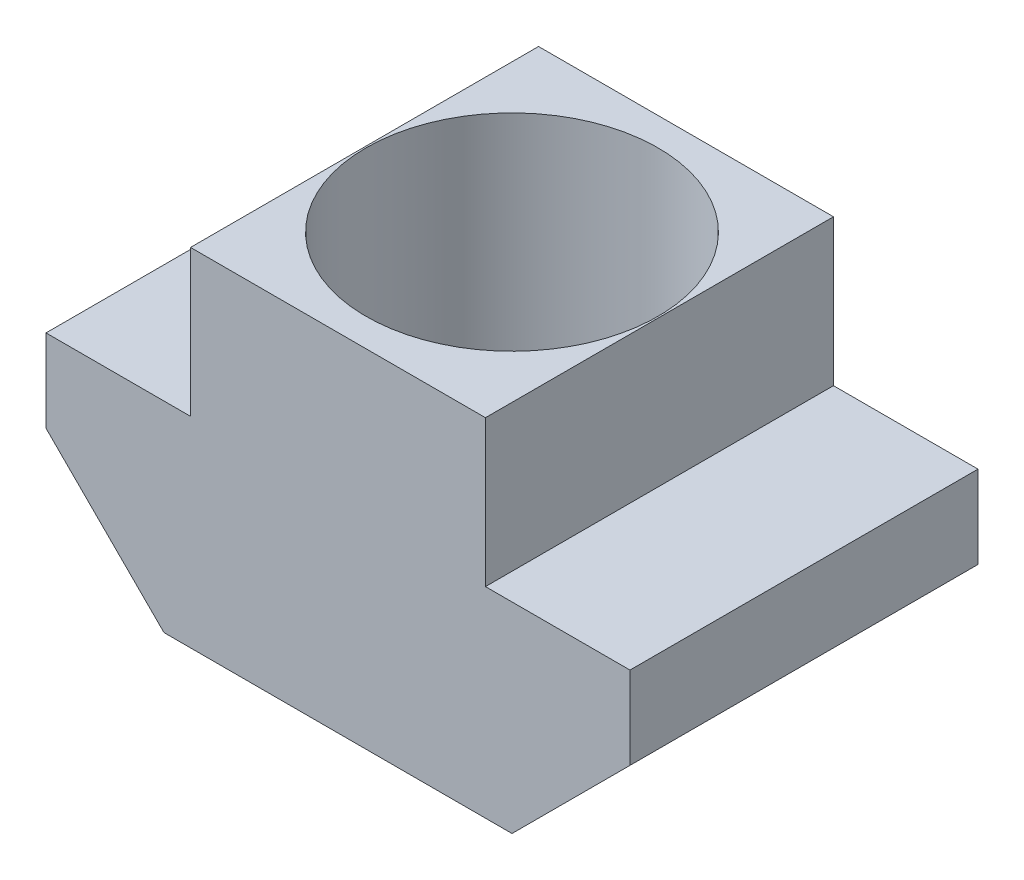
ISO-10303-21;
HEADER;
FILE_DESCRIPTION(('STEP AP214'),'2;1');
FILE_NAME('part.step','',(''),(''),'','','');
FILE_SCHEMA(('AUTOMOTIVE_DESIGN { 1 0 10303 214 1 1 1 1 }'));
ENDSEC;
DATA;
#1=APPLICATION_CONTEXT('core data for automotive mechanical design processes');
#2=APPLICATION_PROTOCOL_DEFINITION('international standard','automotive_design',2000,#1);
#3=PRODUCT_CONTEXT('',#1,'mechanical');
#4=PRODUCT('Part','Part','',(#3));
#5=PRODUCT_RELATED_PRODUCT_CATEGORY('part','',(#4));
#6=PRODUCT_DEFINITION_FORMATION('','',#4);
#7=PRODUCT_DEFINITION_CONTEXT('part definition',#1,'design');
#8=PRODUCT_DEFINITION('design','',#6,#7);
#9=PRODUCT_DEFINITION_SHAPE('','',#8);
#10=(LENGTH_UNIT() NAMED_UNIT(*) SI_UNIT(.MILLI.,.METRE.));
#11=(NAMED_UNIT(*) PLANE_ANGLE_UNIT() SI_UNIT($,.RADIAN.));
#12=(NAMED_UNIT(*) SI_UNIT($,.STERADIAN.) SOLID_ANGLE_UNIT());
#13=UNCERTAINTY_MEASURE_WITH_UNIT(LENGTH_MEASURE(1.E-05),#10,'distance_accuracy_value','');
#14=(GEOMETRIC_REPRESENTATION_CONTEXT(3) GLOBAL_UNCERTAINTY_ASSIGNED_CONTEXT((#13)) GLOBAL_UNIT_ASSIGNED_CONTEXT((#10,
#11,#12)) REPRESENTATION_CONTEXT('',''));
#15=CARTESIAN_POINT('',(0.,0.,0.));
#16=DIRECTION('',(0.,0.,1.));
#17=DIRECTION('',(1.,0.,0.));
#18=AXIS2_PLACEMENT_3D('',#15,#16,#17);
#19=CARTESIAN_POINT('',(-2.5,1.7,5.9));
#20=DIRECTION('',(0.,-1.,0.));
#21=DIRECTION('',(1.,0.,0.));
#22=AXIS2_PLACEMENT_3D('',#19,#20,#21);
#23=PLANE('',#22);
#24=DIRECTION('',(-1.,0.,0.));
#25=VECTOR('',#24,1.);
#26=CARTESIAN_POINT('',(-2.5,1.7,0.));
#27=LINE('',#26,#25);
#28=CARTESIAN_POINT('',(-2.5,1.7,0.));
#29=VERTEX_POINT('',#28);
#30=CARTESIAN_POINT('',(-4.95,1.7,0.));
#31=VERTEX_POINT('',#30);
#32=EDGE_CURVE('E146',#29,#31,#27,.T.);
#33=ORIENTED_EDGE('',*,*,#32,.T.);
#34=DIRECTION('',(0.,0.,-1.));
#35=VECTOR('',#34,1.);
#36=CARTESIAN_POINT('',(-4.95,1.7,5.9));
#37=LINE('',#36,#35);
#38=CARTESIAN_POINT('',(-4.95,1.7,5.9));
#39=VERTEX_POINT('',#38);
#40=EDGE_CURVE('E11',#39,#31,#37,.T.);
#41=ORIENTED_EDGE('',*,*,#40,.F.);
#42=DIRECTION('',(-1.,0.,0.));
#43=VECTOR('',#42,1.);
#44=CARTESIAN_POINT('',(-2.5,1.7,5.9));
#45=LINE('',#44,#43);
#46=CARTESIAN_POINT('',(-2.5,1.7,5.9));
#47=VERTEX_POINT('',#46);
#48=EDGE_CURVE('E165',#47,#39,#45,.T.);
#49=ORIENTED_EDGE('',*,*,#48,.F.);
#50=DIRECTION('',(0.,0.,-1.));
#51=VECTOR('',#50,1.);
#52=CARTESIAN_POINT('',(-2.5,1.7,5.9));
#53=LINE('',#52,#51);
#54=EDGE_CURVE('E142',#47,#29,#53,.T.);
#55=ORIENTED_EDGE('',*,*,#54,.T.);
#56=EDGE_LOOP('',(#33,#41,#49,#55));
#57=FACE_BOUND('',#56,.T.);
#58=ADVANCED_FACE('F38',(#57),#23,.F.);
#59=CARTESIAN_POINT('',(-4.95,0.299999999999998,5.9));
#60=DIRECTION('',(1.,0.,0.));
#61=DIRECTION('',(0.,0.,-1.));
#62=AXIS2_PLACEMENT_3D('',#59,#60,#61);
#63=PLANE('',#62);
#64=DIRECTION('',(0.,-1.,0.));
#65=VECTOR('',#64,1.);
#66=CARTESIAN_POINT('',(-4.95,0.299999999999998,0.));
#67=LINE('',#66,#65);
#68=CARTESIAN_POINT('',(-4.95,0.299999999999998,0.));
#69=VERTEX_POINT('',#68);
#70=EDGE_CURVE('E149',#31,#69,#67,.T.);
#71=ORIENTED_EDGE('',*,*,#70,.T.);
#72=DIRECTION('',(0.,0.,-1.));
#73=VECTOR('',#72,1.);
#74=CARTESIAN_POINT('',(-4.95,0.299999999999998,5.9));
#75=LINE('',#74,#73);
#76=CARTESIAN_POINT('',(-4.95,0.299999999999998,5.9));
#77=VERTEX_POINT('',#76);
#78=EDGE_CURVE('E46',#77,#69,#75,.T.);
#79=ORIENTED_EDGE('',*,*,#78,.F.);
#80=DIRECTION('',(0.,-1.,0.));
#81=VECTOR('',#80,1.);
#82=CARTESIAN_POINT('',(-4.95,0.299999999999998,5.9));
#83=LINE('',#82,#81);
#84=EDGE_CURVE('E103',#39,#77,#83,.T.);
#85=ORIENTED_EDGE('',*,*,#84,.F.);
#86=ORIENTED_EDGE('',*,*,#40,.T.);
#87=EDGE_LOOP('',(#71,#79,#85,#86));
#88=FACE_BOUND('',#87,.T.);
#89=ADVANCED_FACE('F236',(#88),#63,.F.);
#90=CARTESIAN_POINT('',(-2.95,-1.7,5.9));
#91=DIRECTION('',(0.707106781186548,0.707106781186548,0.));
#92=DIRECTION('',(-0.707106781186548,0.707106781186548,0.));
#93=AXIS2_PLACEMENT_3D('',#90,#91,#92);
#94=PLANE('',#93);
#95=DIRECTION('',(0.707106781186548,-0.707106781186548,0.));
#96=VECTOR('',#95,1.);
#97=CARTESIAN_POINT('',(-2.95,-1.7,0.));
#98=LINE('',#97,#96);
#99=CARTESIAN_POINT('',(-2.95,-1.7,0.));
#100=VERTEX_POINT('',#99);
#101=EDGE_CURVE('E152',#69,#100,#98,.T.);
#102=ORIENTED_EDGE('',*,*,#101,.T.);
#103=DIRECTION('',(0.,0.,-1.));
#104=VECTOR('',#103,1.);
#105=CARTESIAN_POINT('',(-2.95,-1.7,5.9));
#106=LINE('',#105,#104);
#107=CARTESIAN_POINT('',(-2.95,-1.7,5.9));
#108=VERTEX_POINT('',#107);
#109=EDGE_CURVE('E178',#108,#100,#106,.T.);
#110=ORIENTED_EDGE('',*,*,#109,.F.);
#111=DIRECTION('',(0.707106781186548,-0.707106781186548,0.));
#112=VECTOR('',#111,1.);
#113=CARTESIAN_POINT('',(-2.95,-1.7,5.9));
#114=LINE('',#113,#112);
#115=EDGE_CURVE('E186',#77,#108,#114,.T.);
#116=ORIENTED_EDGE('',*,*,#115,.F.);
#117=ORIENTED_EDGE('',*,*,#78,.T.);
#118=EDGE_LOOP('',(#102,#110,#116,#117));
#119=FACE_BOUND('',#118,.T.);
#120=ADVANCED_FACE('F184',(#119),#94,.F.);
#121=CARTESIAN_POINT('',(2.95,-1.7,5.9));
#122=DIRECTION('',(0.,1.,0.));
#123=DIRECTION('',(-1.,0.,0.));
#124=AXIS2_PLACEMENT_3D('',#121,#122,#123);
#125=PLANE('',#124);
#126=CARTESIAN_POINT('',(0.,-1.7,2.95));
#127=DIRECTION('',(0.,1.,0.));
#128=DIRECTION('',(-1.,0.,0.));
#129=AXIS2_PLACEMENT_3D('',#126,#127,#128);
#130=CIRCLE('',#129,2.475);
#131=CARTESIAN_POINT('',(-2.475,-1.7,2.95));
#132=VERTEX_POINT('',#131);
#133=EDGE_CURVE('E150',#132,#132,#130,.T.);
#134=ORIENTED_EDGE('',*,*,#133,.T.);
#135=EDGE_LOOP('',(#134));
#136=FACE_BOUND('',#135,.T.);
#137=DIRECTION('',(1.,0.,0.));
#138=VECTOR('',#137,1.);
#139=CARTESIAN_POINT('',(2.95,-1.7,0.));
#140=LINE('',#139,#138);
#141=CARTESIAN_POINT('',(2.95,-1.7,0.));
#142=VERTEX_POINT('',#141);
#143=EDGE_CURVE('E154',#100,#142,#140,.T.);
#144=ORIENTED_EDGE('',*,*,#143,.T.);
#145=DIRECTION('',(0.,0.,-1.));
#146=VECTOR('',#145,1.);
#147=CARTESIAN_POINT('',(2.95,-1.7,5.9));
#148=LINE('',#147,#146);
#149=CARTESIAN_POINT('',(2.95,-1.7,5.9));
#150=VERTEX_POINT('',#149);
#151=EDGE_CURVE('E175',#150,#142,#148,.T.);
#152=ORIENTED_EDGE('',*,*,#151,.F.);
#153=DIRECTION('',(1.,0.,0.));
#154=VECTOR('',#153,1.);
#155=CARTESIAN_POINT('',(2.95,-1.7,5.9));
#156=LINE('',#155,#154);
#157=EDGE_CURVE('E204',#108,#150,#156,.T.);
#158=ORIENTED_EDGE('',*,*,#157,.F.);
#159=ORIENTED_EDGE('',*,*,#109,.T.);
#160=EDGE_LOOP('',(#144,#152,#158,#159));
#161=FACE_BOUND('',#160,.T.);
#162=ADVANCED_FACE('F195',(#136,#161),#125,.F.);
#163=CARTESIAN_POINT('',(4.95,0.300000000000002,5.9));
#164=DIRECTION('',(-0.707106781186548,0.707106781186547,0.));
#165=DIRECTION('',(-0.707106781186547,-0.707106781186548,0.));
#166=AXIS2_PLACEMENT_3D('',#163,#164,#165);
#167=PLANE('',#166);
#168=DIRECTION('',(0.707106781186547,0.707106781186548,0.));
#169=VECTOR('',#168,1.);
#170=CARTESIAN_POINT('',(4.95,0.300000000000002,0.));
#171=LINE('',#170,#169);
#172=CARTESIAN_POINT('',(4.95,0.300000000000002,0.));
#173=VERTEX_POINT('',#172);
#174=EDGE_CURVE('E156',#142,#173,#171,.T.);
#175=ORIENTED_EDGE('',*,*,#174,.T.);
#176=DIRECTION('',(0.,0.,-1.));
#177=VECTOR('',#176,1.);
#178=CARTESIAN_POINT('',(4.95,0.300000000000002,5.9));
#179=LINE('',#178,#177);
#180=CARTESIAN_POINT('',(4.95,0.300000000000002,5.9));
#181=VERTEX_POINT('',#180);
#182=EDGE_CURVE('E172',#181,#173,#179,.T.);
#183=ORIENTED_EDGE('',*,*,#182,.F.);
#184=DIRECTION('',(0.707106781186547,0.707106781186548,0.));
#185=VECTOR('',#184,1.);
#186=CARTESIAN_POINT('',(4.95,0.300000000000002,5.9));
#187=LINE('',#186,#185);
#188=EDGE_CURVE('E201',#150,#181,#187,.T.);
#189=ORIENTED_EDGE('',*,*,#188,.F.);
#190=ORIENTED_EDGE('',*,*,#151,.T.);
#191=EDGE_LOOP('',(#175,#183,#189,#190));
#192=FACE_BOUND('',#191,.T.);
#193=ADVANCED_FACE('F199',(#192),#167,.F.);
#194=CARTESIAN_POINT('',(4.95,0.300000000000002,5.9));
#195=DIRECTION('',(-1.,0.,0.));
#196=DIRECTION('',(0.,0.,1.));
#197=AXIS2_PLACEMENT_3D('',#194,#195,#196);
#198=PLANE('',#197);
#199=DIRECTION('',(0.,1.,0.));
#200=VECTOR('',#199,1.);
#201=CARTESIAN_POINT('',(4.95,0.300000000000002,0.));
#202=LINE('',#201,#200);
#203=CARTESIAN_POINT('',(4.95,1.7,0.));
#204=VERTEX_POINT('',#203);
#205=EDGE_CURVE('E158',#173,#204,#202,.T.);
#206=ORIENTED_EDGE('',*,*,#205,.T.);
#207=DIRECTION('',(0.,0.,-1.));
#208=VECTOR('',#207,1.);
#209=CARTESIAN_POINT('',(4.95,1.7,5.9));
#210=LINE('',#209,#208);
#211=CARTESIAN_POINT('',(4.95,1.7,5.9));
#212=VERTEX_POINT('',#211);
#213=EDGE_CURVE('E169',#212,#204,#210,.T.);
#214=ORIENTED_EDGE('',*,*,#213,.F.);
#215=DIRECTION('',(0.,1.,0.));
#216=VECTOR('',#215,1.);
#217=CARTESIAN_POINT('',(4.95,0.300000000000002,5.9));
#218=LINE('',#217,#216);
#219=EDGE_CURVE('E203',#181,#212,#218,.T.);
#220=ORIENTED_EDGE('',*,*,#219,.F.);
#221=ORIENTED_EDGE('',*,*,#182,.T.);
#222=EDGE_LOOP('',(#206,#214,#220,#221));
#223=FACE_BOUND('',#222,.T.);
#224=ADVANCED_FACE('F247',(#223),#198,.F.);
#225=CARTESIAN_POINT('',(4.95,1.7,5.9));
#226=DIRECTION('',(0.,-1.,0.));
#227=DIRECTION('',(0.,0.,-1.));
#228=AXIS2_PLACEMENT_3D('',#225,#226,#227);
#229=PLANE('',#228);
#230=DIRECTION('',(-1.,0.,0.));
#231=VECTOR('',#230,1.);
#232=CARTESIAN_POINT('',(4.95,1.7,0.));
#233=LINE('',#232,#231);
#234=CARTESIAN_POINT('',(2.5,1.7,0.));
#235=VERTEX_POINT('',#234);
#236=EDGE_CURVE('E160',#204,#235,#233,.T.);
#237=ORIENTED_EDGE('',*,*,#236,.T.);
#238=DIRECTION('',(0.,0.,-1.));
#239=VECTOR('',#238,1.);
#240=CARTESIAN_POINT('',(2.5,1.7,5.9));
#241=LINE('',#240,#239);
#242=CARTESIAN_POINT('',(2.5,1.7,5.9));
#243=VERTEX_POINT('',#242);
#244=EDGE_CURVE('E137',#243,#235,#241,.T.);
#245=ORIENTED_EDGE('',*,*,#244,.F.);
#246=DIRECTION('',(-1.,0.,0.));
#247=VECTOR('',#246,1.);
#248=CARTESIAN_POINT('',(4.95,1.7,5.9));
#249=LINE('',#248,#247);
#250=EDGE_CURVE('E128',#212,#243,#249,.T.);
#251=ORIENTED_EDGE('',*,*,#250,.F.);
#252=ORIENTED_EDGE('',*,*,#213,.T.);
#253=EDGE_LOOP('',(#237,#245,#251,#252));
#254=FACE_BOUND('',#253,.T.);
#255=ADVANCED_FACE('F233',(#254),#229,.F.);
#256=CARTESIAN_POINT('',(2.5,4.18,5.9));
#257=DIRECTION('',(-1.,0.,0.));
#258=DIRECTION('',(0.,-1.,0.));
#259=AXIS2_PLACEMENT_3D('',#256,#257,#258);
#260=PLANE('',#259);
#261=DIRECTION('',(0.,1.,0.));
#262=VECTOR('',#261,1.);
#263=CARTESIAN_POINT('',(2.5,4.18,0.));
#264=LINE('',#263,#262);
#265=CARTESIAN_POINT('',(2.5,4.18,0.));
#266=VERTEX_POINT('',#265);
#267=EDGE_CURVE('E136',#235,#266,#264,.T.);
#268=ORIENTED_EDGE('',*,*,#267,.T.);
#269=DIRECTION('',(0.,0.,-1.));
#270=VECTOR('',#269,1.);
#271=CARTESIAN_POINT('',(2.5,4.18,5.9));
#272=LINE('',#271,#270);
#273=CARTESIAN_POINT('',(2.5,4.18,5.9));
#274=VERTEX_POINT('',#273);
#275=EDGE_CURVE('E133',#274,#266,#272,.T.);
#276=ORIENTED_EDGE('',*,*,#275,.F.);
#277=DIRECTION('',(0.,1.,0.));
#278=VECTOR('',#277,1.);
#279=CARTESIAN_POINT('',(2.5,4.18,5.9));
#280=LINE('',#279,#278);
#281=EDGE_CURVE('E122',#243,#274,#280,.T.);
#282=ORIENTED_EDGE('',*,*,#281,.F.);
#283=ORIENTED_EDGE('',*,*,#244,.T.);
#284=EDGE_LOOP('',(#268,#276,#282,#283));
#285=FACE_BOUND('',#284,.T.);
#286=ADVANCED_FACE('F134',(#285),#260,.F.);
#287=CARTESIAN_POINT('',(2.5,4.18,5.9));
#288=DIRECTION('',(0.,-1.,0.));
#289=DIRECTION('',(1.,0.,0.));
#290=AXIS2_PLACEMENT_3D('',#287,#288,#289);
#291=PLANE('',#290);
#292=CARTESIAN_POINT('',(0.,4.18,2.95));
#293=DIRECTION('',(0.,1.,0.));
#294=DIRECTION('',(-1.,0.,0.));
#295=AXIS2_PLACEMENT_3D('',#292,#293,#294);
#296=CIRCLE('',#295,2.475);
#297=CARTESIAN_POINT('',(-2.475,4.18,2.95));
#298=VERTEX_POINT('',#297);
#299=EDGE_CURVE('E212',#298,#298,#296,.T.);
#300=ORIENTED_EDGE('',*,*,#299,.F.);
#301=EDGE_LOOP('',(#300));
#302=FACE_BOUND('',#301,.T.);
#303=DIRECTION('',(-1.,0.,0.));
#304=VECTOR('',#303,1.);
#305=CARTESIAN_POINT('',(2.5,4.18,0.));
#306=LINE('',#305,#304);
#307=CARTESIAN_POINT('',(-2.5,4.18,0.));
#308=VERTEX_POINT('',#307);
#309=EDGE_CURVE('E89',#266,#308,#306,.T.);
#310=ORIENTED_EDGE('',*,*,#309,.T.);
#311=DIRECTION('',(0.,0.,-1.));
#312=VECTOR('',#311,1.);
#313=CARTESIAN_POINT('',(-2.5,4.18,5.9));
#314=LINE('',#313,#312);
#315=CARTESIAN_POINT('',(-2.5,4.18,5.9));
#316=VERTEX_POINT('',#315);
#317=EDGE_CURVE('E138',#316,#308,#314,.T.);
#318=ORIENTED_EDGE('',*,*,#317,.F.);
#319=DIRECTION('',(-1.,0.,0.));
#320=VECTOR('',#319,1.);
#321=CARTESIAN_POINT('',(2.5,4.18,5.9));
#322=LINE('',#321,#320);
#323=EDGE_CURVE('E126',#274,#316,#322,.T.);
#324=ORIENTED_EDGE('',*,*,#323,.F.);
#325=ORIENTED_EDGE('',*,*,#275,.T.);
#326=EDGE_LOOP('',(#310,#318,#324,#325));
#327=FACE_BOUND('',#326,.T.);
#328=ADVANCED_FACE('F140',(#302,#327),#291,.F.);
#329=CARTESIAN_POINT('',(-2.5,4.18,5.9));
#330=DIRECTION('',(1.,0.,0.));
#331=DIRECTION('',(0.,1.,0.));
#332=AXIS2_PLACEMENT_3D('',#329,#330,#331);
#333=PLANE('',#332);
#334=DIRECTION('',(0.,-1.,0.));
#335=VECTOR('',#334,1.);
#336=CARTESIAN_POINT('',(-2.5,4.18,0.));
#337=LINE('',#336,#335);
#338=EDGE_CURVE('E95',#308,#29,#337,.T.);
#339=ORIENTED_EDGE('',*,*,#338,.T.);
#340=ORIENTED_EDGE('',*,*,#54,.F.);
#341=DIRECTION('',(0.,-1.,0.));
#342=VECTOR('',#341,1.);
#343=CARTESIAN_POINT('',(-2.5,4.18,5.9));
#344=LINE('',#343,#342);
#345=EDGE_CURVE('E54',#316,#47,#344,.T.);
#346=ORIENTED_EDGE('',*,*,#345,.F.);
#347=ORIENTED_EDGE('',*,*,#317,.T.);
#348=EDGE_LOOP('',(#339,#340,#346,#347));
#349=FACE_BOUND('',#348,.T.);
#350=ADVANCED_FACE('F226',(#349),#333,.F.);
#351=CARTESIAN_POINT('',(0.,0.,5.9));
#352=DIRECTION('',(0.,0.,-1.));
#353=DIRECTION('',(-1.,0.,0.));
#354=AXIS2_PLACEMENT_3D('',#351,#352,#353);
#355=PLANE('',#354);
#356=ORIENTED_EDGE('',*,*,#48,.T.);
#357=ORIENTED_EDGE('',*,*,#84,.T.);
#358=ORIENTED_EDGE('',*,*,#115,.T.);
#359=ORIENTED_EDGE('',*,*,#157,.T.);
#360=ORIENTED_EDGE('',*,*,#188,.T.);
#361=ORIENTED_EDGE('',*,*,#219,.T.);
#362=ORIENTED_EDGE('',*,*,#250,.T.);
#363=ORIENTED_EDGE('',*,*,#281,.T.);
#364=ORIENTED_EDGE('',*,*,#323,.T.);
#365=ORIENTED_EDGE('',*,*,#345,.T.);
#366=EDGE_LOOP('',(#356,#357,#358,#359,#360,#361,#362,#363,#364,#365));
#367=FACE_BOUND('',#366,.T.);
#368=ADVANCED_FACE('F124',(#367),#355,.F.);
#369=CARTESIAN_POINT('',(0.,0.,0.));
#370=DIRECTION('',(0.,0.,-1.));
#371=DIRECTION('',(-1.,0.,0.));
#372=AXIS2_PLACEMENT_3D('',#369,#370,#371);
#373=PLANE('',#372);
#374=ORIENTED_EDGE('',*,*,#32,.F.);
#375=ORIENTED_EDGE('',*,*,#338,.F.);
#376=ORIENTED_EDGE('',*,*,#309,.F.);
#377=ORIENTED_EDGE('',*,*,#267,.F.);
#378=ORIENTED_EDGE('',*,*,#236,.F.);
#379=ORIENTED_EDGE('',*,*,#205,.F.);
#380=ORIENTED_EDGE('',*,*,#174,.F.);
#381=ORIENTED_EDGE('',*,*,#143,.F.);
#382=ORIENTED_EDGE('',*,*,#101,.F.);
#383=ORIENTED_EDGE('',*,*,#70,.F.);
#384=EDGE_LOOP('',(#374,#375,#376,#377,#378,#379,#380,#381,#382,#383));
#385=FACE_BOUND('',#384,.T.);
#386=ADVANCED_FACE('F190',(#385),#373,.T.);
#387=CARTESIAN_POINT('',(0.,-1.7,2.95));
#388=DIRECTION('',(0.,1.,0.));
#389=DIRECTION('',(-1.,0.,0.));
#390=AXIS2_PLACEMENT_3D('',#387,#388,#389);
#391=CYLINDRICAL_SURFACE('',#390,2.475);
#392=ORIENTED_EDGE('',*,*,#133,.F.);
#393=EDGE_LOOP('',(#392));
#394=FACE_BOUND('',#393,.T.);
#395=ORIENTED_EDGE('',*,*,#299,.T.);
#396=EDGE_LOOP('',(#395));
#397=FACE_BOUND('',#396,.T.);
#398=ADVANCED_FACE('F219',(#394,#397),#391,.F.);
#399=CLOSED_SHELL('',(#58,#89,#120,#162,#193,#224,#255,#286,#328,#350,#368,#386,#398));
#400=MANIFOLD_SOLID_BREP('B2',#399);
#401=ADVANCED_BREP_SHAPE_REPRESENTATION('',(#18,#400),#14);
#402=SHAPE_DEFINITION_REPRESENTATION(#9,#401);
ENDSEC;
END-ISO-10303-21;
